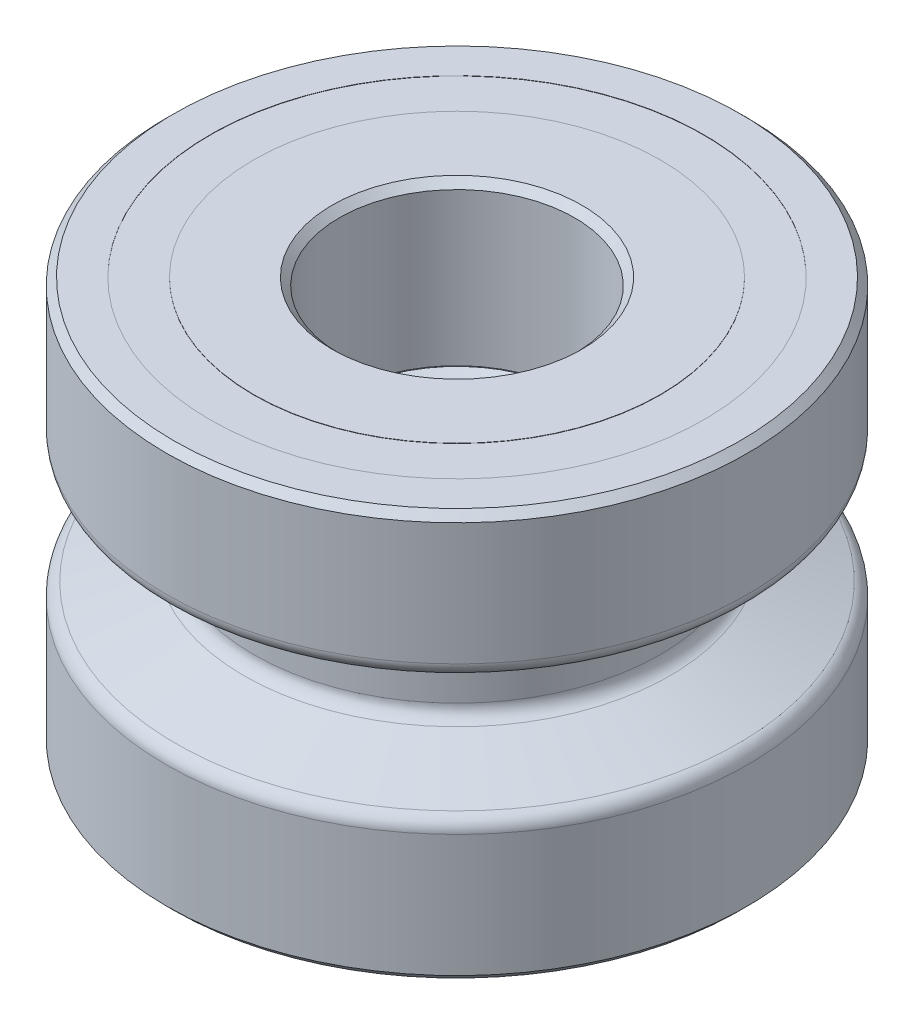
ISO-10303-21;
HEADER;
FILE_DESCRIPTION(('STEP AP214'),'2;1');
FILE_NAME('part.step','',(''),(''),'','','');
FILE_SCHEMA(('AUTOMOTIVE_DESIGN { 1 0 10303 214 1 1 1 1 }'));
ENDSEC;
DATA;
#1=APPLICATION_CONTEXT('core data for automotive mechanical design processes');
#2=APPLICATION_PROTOCOL_DEFINITION('international standard','automotive_design',2000,#1);
#3=PRODUCT_CONTEXT('',#1,'mechanical');
#4=PRODUCT('Part','Part','',(#3));
#5=PRODUCT_RELATED_PRODUCT_CATEGORY('part','',(#4));
#6=PRODUCT_DEFINITION_FORMATION('','',#4);
#7=PRODUCT_DEFINITION_CONTEXT('part definition',#1,'design');
#8=PRODUCT_DEFINITION('design','',#6,#7);
#9=PRODUCT_DEFINITION_SHAPE('','',#8);
#10=(LENGTH_UNIT() NAMED_UNIT(*) SI_UNIT(.MILLI.,.METRE.));
#11=(NAMED_UNIT(*) PLANE_ANGLE_UNIT() SI_UNIT($,.RADIAN.));
#12=(NAMED_UNIT(*) SI_UNIT($,.STERADIAN.) SOLID_ANGLE_UNIT());
#13=UNCERTAINTY_MEASURE_WITH_UNIT(LENGTH_MEASURE(1.E-05),#10,'distance_accuracy_value','');
#14=(GEOMETRIC_REPRESENTATION_CONTEXT(3) GLOBAL_UNCERTAINTY_ASSIGNED_CONTEXT((#13)) GLOBAL_UNIT_ASSIGNED_CONTEXT((#10,
#11,#12)) REPRESENTATION_CONTEXT('',''));
#15=CARTESIAN_POINT('',(0.,0.,0.));
#16=DIRECTION('',(0.,0.,1.));
#17=DIRECTION('',(1.,0.,0.));
#18=AXIS2_PLACEMENT_3D('',#15,#16,#17);
#19=CARTESIAN_POINT('',(0.,7.,0.));
#20=DIRECTION('',(0.,1.,0.));
#21=DIRECTION('',(0.,0.,1.));
#22=AXIS2_PLACEMENT_3D('',#19,#20,#21);
#23=PLANE('',#22);
#24=CARTESIAN_POINT('',(0.,7.,0.));
#25=DIRECTION('',(0.,1.,0.));
#26=DIRECTION('',(0.,0.,1.));
#27=AXIS2_PLACEMENT_3D('',#24,#25,#26);
#28=CIRCLE('',#27,4.30000000000001);
#29=CARTESIAN_POINT('',(0.,7.,4.30000000000001));
#30=VERTEX_POINT('',#29);
#31=EDGE_CURVE('E61',#30,#30,#28,.F.);
#32=ORIENTED_EDGE('',*,*,#31,.T.);
#33=EDGE_LOOP('',(#32));
#34=FACE_BOUND('',#33,.T.);
#35=CARTESIAN_POINT('',(0.,7.,0.));
#36=DIRECTION('',(0.,1.,0.));
#37=DIRECTION('',(0.,0.,1.));
#38=AXIS2_PLACEMENT_3D('',#35,#36,#37);
#39=CIRCLE('',#38,7.);
#40=CARTESIAN_POINT('',(0.,7.,7.));
#41=VERTEX_POINT('',#40);
#42=EDGE_CURVE('E124',#41,#41,#39,.T.);
#43=ORIENTED_EDGE('',*,*,#42,.T.);
#44=EDGE_LOOP('',(#43));
#45=FACE_BOUND('',#44,.T.);
#46=ADVANCED_FACE('F42',(#34,#45),#23,.T.);
#47=CARTESIAN_POINT('',(0.,7.001,0.));
#48=DIRECTION('',(0.,-1.,0.));
#49=DIRECTION('',(0.,0.,-1.));
#50=AXIS2_PLACEMENT_3D('',#47,#48,#49);
#51=CYLINDRICAL_SURFACE('',#50,3.5);
#52=CARTESIAN_POINT('',(0.,1.20000000000001,0.));
#53=DIRECTION('',(0.,1.,0.));
#54=DIRECTION('',(0.,0.,1.));
#55=AXIS2_PLACEMENT_3D('',#52,#53,#54);
#56=CIRCLE('',#55,3.5);
#57=CARTESIAN_POINT('',(0.,1.2,-3.5));
#58=VERTEX_POINT('',#57);
#59=EDGE_CURVE('E10',#58,#58,#56,.T.);
#60=CARTESIAN_POINT('',(0.,-4.5,0.));
#61=DIRECTION('',(0.,-1.,0.));
#62=DIRECTION('',(0.,0.,-1.));
#63=AXIS2_PLACEMENT_3D('',#60,#61,#62);
#64=CIRCLE('',#63,3.5);
#65=CARTESIAN_POINT('',(0.,-4.5,-3.5));
#66=VERTEX_POINT('',#65);
#67=EDGE_CURVE('E85',#66,#66,#64,.F.);
#68=CARTESIAN_POINT('',(0.,1.2,-3.5));
#69=CARTESIAN_POINT('',(0.,1.140625,-3.5));
#70=CARTESIAN_POINT('',(0.,1.08125,-3.5));
#71=CARTESIAN_POINT('',(0.,0.962500000000004,-3.5));
#72=CARTESIAN_POINT('',(0.,0.903125000000004,-3.5));
#73=CARTESIAN_POINT('',(0.,0.784375000000004,-3.5));
#74=CARTESIAN_POINT('',(0.,0.725000000000005,-3.5));
#75=CARTESIAN_POINT('',(0.,0.606250000000005,-3.5));
#76=CARTESIAN_POINT('',(0.,0.546875000000005,-3.5));
#77=CARTESIAN_POINT('',(0.,0.428125000000004,-3.5));
#78=CARTESIAN_POINT('',(0.,0.368750000000004,-3.5));
#79=CARTESIAN_POINT('',(0.,0.250000000000004,-3.5));
#80=CARTESIAN_POINT('',(0.,0.190625000000004,-3.5));
#81=CARTESIAN_POINT('',(0.,0.0718750000000037,-3.5));
#82=CARTESIAN_POINT('',(0.,0.0125000000000035,-3.5));
#83=CARTESIAN_POINT('',(0.,-0.106249999999996,-3.5));
#84=CARTESIAN_POINT('',(0.,-0.165624999999996,-3.5));
#85=CARTESIAN_POINT('',(0.,-0.284374999999996,-3.5));
#86=CARTESIAN_POINT('',(0.,-0.343749999999996,-3.5));
#87=CARTESIAN_POINT('',(0.,-0.462499999999996,-3.5));
#88=CARTESIAN_POINT('',(0.,-0.521874999999997,-3.5));
#89=CARTESIAN_POINT('',(0.,-0.640624999999997,-3.5));
#90=CARTESIAN_POINT('',(0.,-0.699999999999997,-3.5));
#91=CARTESIAN_POINT('',(0.,-0.818749999999997,-3.5));
#92=CARTESIAN_POINT('',(0.,-0.878124999999997,-3.5));
#93=CARTESIAN_POINT('',(0.,-0.996874999999996,-3.5));
#94=CARTESIAN_POINT('',(0.,-1.05625,-3.5));
#95=CARTESIAN_POINT('',(0.,-1.175,-3.5));
#96=CARTESIAN_POINT('',(0.,-1.234375,-3.5));
#97=CARTESIAN_POINT('',(0.,-1.353125,-3.5));
#98=CARTESIAN_POINT('',(0.,-1.4125,-3.5));
#99=CARTESIAN_POINT('',(0.,-1.53125,-3.5));
#100=CARTESIAN_POINT('',(0.,-1.590625,-3.5));
#101=CARTESIAN_POINT('',(0.,-1.709375,-3.5));
#102=CARTESIAN_POINT('',(0.,-1.76875,-3.5));
#103=CARTESIAN_POINT('',(0.,-1.8875,-3.5));
#104=CARTESIAN_POINT('',(0.,-1.946875,-3.5));
#105=CARTESIAN_POINT('',(0.,-2.065625,-3.5));
#106=CARTESIAN_POINT('',(0.,-2.125,-3.5));
#107=CARTESIAN_POINT('',(0.,-2.24375,-3.5));
#108=CARTESIAN_POINT('',(0.,-2.303125,-3.5));
#109=CARTESIAN_POINT('',(0.,-2.421875,-3.5));
#110=CARTESIAN_POINT('',(0.,-2.48125,-3.5));
#111=CARTESIAN_POINT('',(0.,-2.6,-3.5));
#112=CARTESIAN_POINT('',(0.,-2.659375,-3.5));
#113=CARTESIAN_POINT('',(0.,-2.778125,-3.5));
#114=CARTESIAN_POINT('',(0.,-2.8375,-3.5));
#115=CARTESIAN_POINT('',(0.,-2.95625,-3.5));
#116=CARTESIAN_POINT('',(0.,-3.015625,-3.5));
#117=CARTESIAN_POINT('',(0.,-3.134375,-3.5));
#118=CARTESIAN_POINT('',(0.,-3.19375,-3.5));
#119=CARTESIAN_POINT('',(0.,-3.3125,-3.5));
#120=CARTESIAN_POINT('',(0.,-3.371875,-3.5));
#121=CARTESIAN_POINT('',(0.,-3.490625,-3.5));
#122=CARTESIAN_POINT('',(0.,-3.55,-3.5));
#123=CARTESIAN_POINT('',(0.,-3.66875,-3.5));
#124=CARTESIAN_POINT('',(0.,-3.728125,-3.5));
#125=CARTESIAN_POINT('',(0.,-3.846875,-3.5));
#126=CARTESIAN_POINT('',(0.,-3.90625,-3.5));
#127=CARTESIAN_POINT('',(0.,-4.025,-3.5));
#128=CARTESIAN_POINT('',(0.,-4.084375,-3.5));
#129=CARTESIAN_POINT('',(0.,-4.203125,-3.5));
#130=CARTESIAN_POINT('',(0.,-4.2625,-3.5));
#131=CARTESIAN_POINT('',(0.,-4.38125,-3.5));
#132=CARTESIAN_POINT('',(0.,-4.440625,-3.5));
#133=CARTESIAN_POINT('',(0.,-4.5,-3.5));
#134=B_SPLINE_CURVE_WITH_KNOTS('',3,(#68,#69,#70,#71,#72,#73,#74,#75,#76,#77,#78,#79,#80,#81,
#82,#83,#84,#85,#86,#87,#88,#89,#90,#91,#92,#93,#94,#95,#96,#97,#98,#99,#100,#101,#102,#103,
#104,#105,#106,#107,#108,#109,#110,#111,#112,#113,#114,#115,#116,#117,#118,#119,#120,#121,#122,
#123,#124,#125,#126,#127,#128,#129,#130,#131,#132,#133),.UNSPECIFIED.,.F.,.F.,(4,2,2,2,2,2,2,2,
2,2,2,2,2,2,2,2,2,2,2,2,2,2,2,2,2,2,2,2,2,2,2,2,4),(0.,0.178125,0.356250000000001,0.534375,
0.7125,0.890625000000001,1.06875,1.246875,1.425,1.603125,1.78125,1.959375,2.1375,2.315625,
2.49375,2.671875,2.85,3.028125,3.20625,3.384375,3.5625,3.740625,3.91875,4.096875,4.275,4.453125,
4.63125,4.809375,4.9875,5.165625,5.34375,5.521875,5.7),.UNSPECIFIED.);
#135=EDGE_CURVE('BSEAM161',#58,#66,#134,.T.);
#136=ORIENTED_EDGE('',*,*,#59,.T.);
#137=ORIENTED_EDGE('',*,*,#67,.F.);
#138=ORIENTED_EDGE('',*,*,#135,.T.);
#139=ORIENTED_EDGE('',*,*,#135,.F.);
#140=EDGE_LOOP('',(#136,#138,#137,#139));
#141=FACE_BOUND('',#140,.T.);
#142=ADVANCED_FACE('F161',(#141),#51,.F.);
#143=CARTESIAN_POINT('',(0.,7.,0.));
#144=DIRECTION('',(0.,-1.,0.));
#145=DIRECTION('',(0.,0.,-1.));
#146=AXIS2_PLACEMENT_3D('',#143,#144,#145);
#147=CYLINDRICAL_SURFACE('',#146,10.);
#148=CARTESIAN_POINT('',(0.,-6.74999999999999,0.));
#149=DIRECTION('',(0.,1.,0.));
#150=DIRECTION('',(0.,0.,1.));
#151=AXIS2_PLACEMENT_3D('',#148,#149,#150);
#152=CIRCLE('',#151,10.);
#153=CARTESIAN_POINT('',(0.,-6.74999999999999,10.));
#154=VERTEX_POINT('',#153);
#155=EDGE_CURVE('E78',#154,#154,#152,.T.);
#156=ORIENTED_EDGE('',*,*,#155,.T.);
#157=EDGE_LOOP('',(#156));
#158=FACE_BOUND('',#157,.T.);
#159=CARTESIAN_POINT('',(0.,-2.54201447190344,0.));
#160=DIRECTION('',(0.,-1.,0.));
#161=DIRECTION('',(0.,0.,-1.));
#162=AXIS2_PLACEMENT_3D('',#159,#160,#161);
#163=CIRCLE('',#162,10.);
#164=CARTESIAN_POINT('',(0.,-2.54201447190344,-10.));
#165=VERTEX_POINT('',#164);
#166=EDGE_CURVE('E82',#165,#165,#163,.T.);
#167=ORIENTED_EDGE('',*,*,#166,.T.);
#168=EDGE_LOOP('',(#167));
#169=FACE_BOUND('',#168,.T.);
#170=ADVANCED_FACE('F156',(#158,#169),#147,.T.);
#171=CARTESIAN_POINT('',(0.,6.75,0.));
#172=DIRECTION('',(0.,1.,0.));
#173=DIRECTION('',(0.,0.,1.));
#174=AXIS2_PLACEMENT_3D('',#171,#172,#173);
#175=CIRCLE('',#174,10.);
#176=CARTESIAN_POINT('',(0.,6.75,10.));
#177=VERTEX_POINT('',#176);
#178=EDGE_CURVE('E57',#177,#177,#175,.F.);
#179=ORIENTED_EDGE('',*,*,#178,.T.);
#180=EDGE_LOOP('',(#179));
#181=FACE_BOUND('',#180,.T.);
#182=CARTESIAN_POINT('',(0.,2.54201447190344,0.));
#183=DIRECTION('',(0.,-1.,0.));
#184=DIRECTION('',(0.,0.,-1.));
#185=AXIS2_PLACEMENT_3D('',#182,#183,#184);
#186=CIRCLE('',#185,10.);
#187=CARTESIAN_POINT('',(0.,2.54201447190344,-10.));
#188=VERTEX_POINT('',#187);
#189=EDGE_CURVE('E93',#188,#188,#186,.F.);
#190=ORIENTED_EDGE('',*,*,#189,.T.);
#191=EDGE_LOOP('',(#190));
#192=FACE_BOUND('',#191,.T.);
#193=ADVANCED_FACE('F147',(#181,#192),#147,.T.);
#194=CARTESIAN_POINT('',(0.,7.,0.));
#195=DIRECTION('',(0.,1.,0.));
#196=DIRECTION('',(0.,0.,1.));
#197=AXIS2_PLACEMENT_3D('',#194,#195,#196);
#198=CIRCLE('',#197,9.74999999999999);
#199=CARTESIAN_POINT('',(0.,7.,9.74999999999999));
#200=VERTEX_POINT('',#199);
#201=EDGE_CURVE('E58',#200,#200,#198,.T.);
#202=ORIENTED_EDGE('',*,*,#201,.T.);
#203=EDGE_LOOP('',(#202));
#204=FACE_BOUND('',#203,.T.);
#205=CARTESIAN_POINT('',(0.,7.,0.));
#206=DIRECTION('',(0.,1.,0.));
#207=DIRECTION('',(0.,0.,1.));
#208=AXIS2_PLACEMENT_3D('',#205,#206,#207);
#209=CIRCLE('',#208,8.5);
#210=CARTESIAN_POINT('',(0.,7.,8.5));
#211=VERTEX_POINT('',#210);
#212=EDGE_CURVE('E120',#211,#211,#209,.T.);
#213=ORIENTED_EDGE('',*,*,#212,.F.);
#214=EDGE_LOOP('',(#213));
#215=FACE_BOUND('',#214,.T.);
#216=ADVANCED_FACE('F143',(#204,#215),#23,.T.);
#217=CARTESIAN_POINT('',(0.,-7.,0.));
#218=DIRECTION('',(0.,1.,0.));
#219=DIRECTION('',(0.,0.,1.));
#220=AXIS2_PLACEMENT_3D('',#217,#218,#219);
#221=PLANE('',#220);
#222=CARTESIAN_POINT('',(0.,-7.,0.));
#223=DIRECTION('',(0.,1.,0.));
#224=DIRECTION('',(0.,0.,1.));
#225=AXIS2_PLACEMENT_3D('',#222,#223,#224);
#226=CIRCLE('',#225,9.75);
#227=CARTESIAN_POINT('',(0.,-7.,9.75));
#228=VERTEX_POINT('',#227);
#229=EDGE_CURVE('E72',#228,#228,#226,.F.);
#230=ORIENTED_EDGE('',*,*,#229,.T.);
#231=EDGE_LOOP('',(#230));
#232=FACE_BOUND('',#231,.T.);
#233=CARTESIAN_POINT('',(0.,-7.,0.));
#234=DIRECTION('',(0.,1.,0.));
#235=DIRECTION('',(0.,0.,1.));
#236=AXIS2_PLACEMENT_3D('',#233,#234,#235);
#237=CIRCLE('',#236,4.30000000000001);
#238=CARTESIAN_POINT('',(0.,-7.,4.30000000000001));
#239=VERTEX_POINT('',#238);
#240=EDGE_CURVE('E80',#239,#239,#237,.T.);
#241=ORIENTED_EDGE('',*,*,#240,.T.);
#242=EDGE_LOOP('',(#241));
#243=FACE_BOUND('',#242,.T.);
#244=ADVANCED_FACE('F149',(#232,#243),#221,.F.);
#245=CARTESIAN_POINT('',(0.,-1.1,0.));
#246=DIRECTION('',(0.,-1.,0.));
#247=DIRECTION('',(0.,0.,-1.));
#248=AXIS2_PLACEMENT_3D('',#245,#246,#247);
#249=CONICAL_SURFACE('',#248,7.,1.22173047639604);
#250=CARTESIAN_POINT('',(0.,-1.2197425412881,0.));
#251=DIRECTION('',(0.,-1.,0.));
#252=DIRECTION('',(0.,0.,-1.));
#253=AXIS2_PLACEMENT_3D('',#250,#251,#252);
#254=CIRCLE('',#253,7.32898992833717);
#255=CARTESIAN_POINT('',(0.,-1.2197425412881,-7.32898992833717));
#256=VERTEX_POINT('',#255);
#257=EDGE_CURVE('E99',#256,#256,#254,.T.);
#258=ORIENTED_EDGE('',*,*,#257,.T.);
#259=EDGE_LOOP('',(#258));
#260=FACE_BOUND('',#259,.T.);
#261=CARTESIAN_POINT('',(0.,-2.07216816151049,0.));
#262=DIRECTION('',(0.,-1.,0.));
#263=DIRECTION('',(0.,0.,-1.));
#264=AXIS2_PLACEMENT_3D('',#261,#262,#263);
#265=CIRCLE('',#264,9.67101007166283);
#266=CARTESIAN_POINT('',(0.,-2.07216816151049,-9.67101007166283));
#267=VERTEX_POINT('',#266);
#268=EDGE_CURVE('E101',#267,#267,#265,.F.);
#269=ORIENTED_EDGE('',*,*,#268,.T.);
#270=EDGE_LOOP('',(#269));
#271=FACE_BOUND('',#270,.T.);
#272=ADVANCED_FACE('F155',(#260,#271),#249,.T.);
#273=CARTESIAN_POINT('',(0.,7.,0.));
#274=DIRECTION('',(0.,1.,0.));
#275=DIRECTION('',(0.,0.,1.));
#276=AXIS2_PLACEMENT_3D('',#273,#274,#275);
#277=CYLINDRICAL_SURFACE('',#276,7.);
#278=CARTESIAN_POINT('',(0.,-0.749896230895142,0.));
#279=DIRECTION('',(0.,1.,0.));
#280=DIRECTION('',(0.,0.,1.));
#281=AXIS2_PLACEMENT_3D('',#278,#279,#280);
#282=CIRCLE('',#281,7.);
#283=CARTESIAN_POINT('',(0.,-0.749896230895142,7.));
#284=VERTEX_POINT('',#283);
#285=EDGE_CURVE('E106',#284,#284,#282,.T.);
#286=ORIENTED_EDGE('',*,*,#285,.T.);
#287=EDGE_LOOP('',(#286));
#288=FACE_BOUND('',#287,.T.);
#289=CARTESIAN_POINT('',(0.,0.749896230895143,0.));
#290=DIRECTION('',(0.,1.,0.));
#291=DIRECTION('',(0.,0.,1.));
#292=AXIS2_PLACEMENT_3D('',#289,#290,#291);
#293=CIRCLE('',#292,7.);
#294=CARTESIAN_POINT('',(0.,0.749896230895143,7.));
#295=VERTEX_POINT('',#294);
#296=EDGE_CURVE('E87',#295,#295,#293,.F.);
#297=ORIENTED_EDGE('',*,*,#296,.T.);
#298=EDGE_LOOP('',(#297));
#299=FACE_BOUND('',#298,.T.);
#300=ADVANCED_FACE('F205',(#288,#299),#277,.T.);
#301=CARTESIAN_POINT('',(0.,2.19191070279859,0.));
#302=DIRECTION('',(0.,1.,0.));
#303=DIRECTION('',(0.,0.,1.));
#304=AXIS2_PLACEMENT_3D('',#301,#302,#303);
#305=CONICAL_SURFACE('',#304,10.,1.22173047639604);
#306=CARTESIAN_POINT('',(0.,1.2197425412881,0.));
#307=DIRECTION('',(0.,1.,0.));
#308=DIRECTION('',(0.,0.,1.));
#309=AXIS2_PLACEMENT_3D('',#306,#307,#308);
#310=CIRCLE('',#309,7.32898992833717);
#311=CARTESIAN_POINT('',(0.,1.2197425412881,7.32898992833717));
#312=VERTEX_POINT('',#311);
#313=EDGE_CURVE('E92',#312,#312,#310,.T.);
#314=ORIENTED_EDGE('',*,*,#313,.T.);
#315=EDGE_LOOP('',(#314));
#316=FACE_BOUND('',#315,.T.);
#317=CARTESIAN_POINT('',(0.,2.07216816151048,0.));
#318=DIRECTION('',(0.,1.,0.));
#319=DIRECTION('',(0.,0.,1.));
#320=AXIS2_PLACEMENT_3D('',#317,#318,#319);
#321=CIRCLE('',#320,9.67101007166283);
#322=CARTESIAN_POINT('',(0.,2.07216816151048,9.67101007166283));
#323=VERTEX_POINT('',#322);
#324=EDGE_CURVE('E97',#323,#323,#321,.F.);
#325=ORIENTED_EDGE('',*,*,#324,.T.);
#326=EDGE_LOOP('',(#325));
#327=FACE_BOUND('',#326,.T.);
#328=ADVANCED_FACE('F196',(#316,#327),#305,.T.);
#329=CARTESIAN_POINT('',(0.,-0.749896230895142,0.));
#330=DIRECTION('',(0.,1.,0.));
#331=DIRECTION('',(0.,0.,1.));
#332=AXIS2_PLACEMENT_3D('',#329,#330,#331);
#333=TOROIDAL_SURFACE('',#332,7.5,0.5);
#334=ORIENTED_EDGE('',*,*,#257,.F.);
#335=EDGE_LOOP('',(#334));
#336=FACE_BOUND('',#335,.T.);
#337=ORIENTED_EDGE('',*,*,#285,.F.);
#338=EDGE_LOOP('',(#337));
#339=FACE_BOUND('',#338,.T.);
#340=ADVANCED_FACE('F201',(#336,#339),#333,.F.);
#341=CARTESIAN_POINT('',(0.,0.749896230895143,0.));
#342=DIRECTION('',(0.,1.,0.));
#343=DIRECTION('',(0.,0.,1.));
#344=AXIS2_PLACEMENT_3D('',#341,#342,#343);
#345=TOROIDAL_SURFACE('',#344,7.5,0.5);
#346=ORIENTED_EDGE('',*,*,#296,.F.);
#347=EDGE_LOOP('',(#346));
#348=FACE_BOUND('',#347,.T.);
#349=ORIENTED_EDGE('',*,*,#313,.F.);
#350=EDGE_LOOP('',(#349));
#351=FACE_BOUND('',#350,.T.);
#352=ADVANCED_FACE('F225',(#348,#351),#345,.F.);
#353=CARTESIAN_POINT('',(0.,2.54201447190344,0.));
#354=DIRECTION('',(0.,-1.,0.));
#355=DIRECTION('',(0.,0.,-1.));
#356=AXIS2_PLACEMENT_3D('',#353,#354,#355);
#357=TOROIDAL_SURFACE('',#356,9.5,0.5);
#358=ORIENTED_EDGE('',*,*,#324,.F.);
#359=EDGE_LOOP('',(#358));
#360=FACE_BOUND('',#359,.T.);
#361=ORIENTED_EDGE('',*,*,#189,.F.);
#362=EDGE_LOOP('',(#361));
#363=FACE_BOUND('',#362,.T.);
#364=ADVANCED_FACE('F216',(#360,#363),#357,.T.);
#365=CARTESIAN_POINT('',(0.,-2.54201447190344,0.));
#366=DIRECTION('',(0.,-1.,0.));
#367=DIRECTION('',(0.,0.,-1.));
#368=AXIS2_PLACEMENT_3D('',#365,#366,#367);
#369=TOROIDAL_SURFACE('',#368,9.5,0.5);
#370=ORIENTED_EDGE('',*,*,#166,.F.);
#371=EDGE_LOOP('',(#370));
#372=FACE_BOUND('',#371,.T.);
#373=ORIENTED_EDGE('',*,*,#268,.F.);
#374=EDGE_LOOP('',(#373));
#375=FACE_BOUND('',#374,.T.);
#376=ADVANCED_FACE('F192',(#372,#375),#369,.T.);
#377=CARTESIAN_POINT('',(0.,-4.5,0.));
#378=DIRECTION('',(0.,-1.,0.));
#379=DIRECTION('',(0.,0.,-1.));
#380=AXIS2_PLACEMENT_3D('',#377,#378,#379);
#381=PLANE('',#380);
#382=CARTESIAN_POINT('',(0.,-4.5,0.));
#383=DIRECTION('',(0.,-1.,0.));
#384=DIRECTION('',(0.,0.,-1.));
#385=AXIS2_PLACEMENT_3D('',#382,#383,#384);
#386=CIRCLE('',#385,4.05);
#387=CARTESIAN_POINT('',(0.,-4.5,-4.05));
#388=VERTEX_POINT('',#387);
#389=EDGE_CURVE('E89',#388,#388,#386,.T.);
#390=ORIENTED_EDGE('',*,*,#389,.T.);
#391=EDGE_LOOP('',(#390));
#392=FACE_BOUND('',#391,.T.);
#393=ORIENTED_EDGE('',*,*,#67,.T.);
#394=EDGE_LOOP('',(#393));
#395=FACE_BOUND('',#394,.T.);
#396=ADVANCED_FACE('F188',(#392,#395),#381,.T.);
#397=CARTESIAN_POINT('',(0.,-4.5,0.));
#398=DIRECTION('',(0.,-1.,0.));
#399=DIRECTION('',(0.,0.,-1.));
#400=AXIS2_PLACEMENT_3D('',#397,#398,#399);
#401=CYLINDRICAL_SURFACE('',#400,4.05);
#402=CARTESIAN_POINT('',(0.,-6.74999999999999,0.));
#403=DIRECTION('',(0.,1.,0.));
#404=DIRECTION('',(0.,0.,1.));
#405=AXIS2_PLACEMENT_3D('',#402,#403,#404);
#406=CIRCLE('',#405,4.05);
#407=CARTESIAN_POINT('',(0.,-6.74999999999999,4.05));
#408=VERTEX_POINT('',#407);
#409=EDGE_CURVE('E71',#408,#408,#406,.F.);
#410=ORIENTED_EDGE('',*,*,#409,.T.);
#411=EDGE_LOOP('',(#410));
#412=FACE_BOUND('',#411,.T.);
#413=ORIENTED_EDGE('',*,*,#389,.F.);
#414=EDGE_LOOP('',(#413));
#415=FACE_BOUND('',#414,.T.);
#416=ADVANCED_FACE('F187',(#412,#415),#401,.F.);
#417=CARTESIAN_POINT('',(0.,1.5,0.));
#418=DIRECTION('',(0.,1.,0.));
#419=DIRECTION('',(0.,0.,1.));
#420=AXIS2_PLACEMENT_3D('',#417,#418,#419);
#421=PLANE('',#420);
#422=CARTESIAN_POINT('',(0.,1.5,0.));
#423=DIRECTION('',(0.,1.,0.));
#424=DIRECTION('',(0.,0.,1.));
#425=AXIS2_PLACEMENT_3D('',#422,#423,#424);
#426=CIRCLE('',#425,4.01961524227066);
#427=CARTESIAN_POINT('',(0.,1.5,4.01961524227066));
#428=VERTEX_POINT('',#427);
#429=EDGE_CURVE('E55',#428,#428,#426,.F.);
#430=ORIENTED_EDGE('',*,*,#429,.T.);
#431=EDGE_LOOP('',(#430));
#432=FACE_BOUND('',#431,.T.);
#433=CARTESIAN_POINT('',(0.,1.5,0.));
#434=DIRECTION('',(0.,1.,0.));
#435=DIRECTION('',(0.,0.,1.));
#436=AXIS2_PLACEMENT_3D('',#433,#434,#435);
#437=CIRCLE('',#436,4.05);
#438=CARTESIAN_POINT('',(0.,1.5,4.05));
#439=VERTEX_POINT('',#438);
#440=EDGE_CURVE('E113',#439,#439,#437,.T.);
#441=ORIENTED_EDGE('',*,*,#440,.T.);
#442=EDGE_LOOP('',(#441));
#443=FACE_BOUND('',#442,.T.);
#444=ADVANCED_FACE('F182',(#432,#443),#421,.T.);
#445=CARTESIAN_POINT('',(0.,1.5,0.));
#446=DIRECTION('',(0.,1.,0.));
#447=DIRECTION('',(0.,0.,1.));
#448=AXIS2_PLACEMENT_3D('',#445,#446,#447);
#449=CYLINDRICAL_SURFACE('',#448,4.05);
#450=CARTESIAN_POINT('',(0.,6.74999999999999,0.));
#451=DIRECTION('',(0.,1.,0.));
#452=DIRECTION('',(0.,0.,1.));
#453=AXIS2_PLACEMENT_3D('',#450,#451,#452);
#454=CIRCLE('',#453,4.05);
#455=CARTESIAN_POINT('',(0.,6.74999999999999,4.05));
#456=VERTEX_POINT('',#455);
#457=EDGE_CURVE('E66',#456,#456,#454,.T.);
#458=ORIENTED_EDGE('',*,*,#457,.T.);
#459=EDGE_LOOP('',(#458));
#460=FACE_BOUND('',#459,.T.);
#461=ORIENTED_EDGE('',*,*,#440,.F.);
#462=EDGE_LOOP('',(#461));
#463=FACE_BOUND('',#462,.T.);
#464=ADVANCED_FACE('F142',(#460,#463),#449,.F.);
#465=CARTESIAN_POINT('',(0.,6.99,0.));
#466=DIRECTION('',(0.,1.,0.));
#467=DIRECTION('',(0.,0.,1.));
#468=AXIS2_PLACEMENT_3D('',#465,#466,#467);
#469=CYLINDRICAL_SURFACE('',#468,8.5);
#470=CARTESIAN_POINT('',(0.,6.99,0.));
#471=DIRECTION('',(0.,1.,0.));
#472=DIRECTION('',(0.,0.,1.));
#473=AXIS2_PLACEMENT_3D('',#470,#471,#472);
#474=CIRCLE('',#473,8.5);
#475=CARTESIAN_POINT('',(0.,6.99,8.5));
#476=VERTEX_POINT('',#475);
#477=EDGE_CURVE('E116',#476,#476,#474,.T.);
#478=CARTESIAN_POINT('',(0.,6.99,8.5));
#479=CARTESIAN_POINT('',(0.,6.99010416666667,8.5));
#480=CARTESIAN_POINT('',(0.,6.99020833333333,8.5));
#481=CARTESIAN_POINT('',(0.,6.99041666666667,8.5));
#482=CARTESIAN_POINT('',(0.,6.99052083333333,8.5));
#483=CARTESIAN_POINT('',(0.,6.99072916666667,8.5));
#484=CARTESIAN_POINT('',(0.,6.99083333333333,8.5));
#485=CARTESIAN_POINT('',(0.,6.99104166666667,8.5));
#486=CARTESIAN_POINT('',(0.,6.99114583333333,8.5));
#487=CARTESIAN_POINT('',(0.,6.99135416666667,8.5));
#488=CARTESIAN_POINT('',(0.,6.99145833333333,8.5));
#489=CARTESIAN_POINT('',(0.,6.99166666666667,8.5));
#490=CARTESIAN_POINT('',(0.,6.99177083333333,8.5));
#491=CARTESIAN_POINT('',(0.,6.99197916666667,8.5));
#492=CARTESIAN_POINT('',(0.,6.99208333333333,8.5));
#493=CARTESIAN_POINT('',(0.,6.99229166666667,8.5));
#494=CARTESIAN_POINT('',(0.,6.99239583333333,8.5));
#495=CARTESIAN_POINT('',(0.,6.99260416666667,8.5));
#496=CARTESIAN_POINT('',(0.,6.99270833333333,8.5));
#497=CARTESIAN_POINT('',(0.,6.99291666666667,8.5));
#498=CARTESIAN_POINT('',(0.,6.99302083333333,8.5));
#499=CARTESIAN_POINT('',(0.,6.99322916666667,8.5));
#500=CARTESIAN_POINT('',(0.,6.99333333333333,8.5));
#501=CARTESIAN_POINT('',(0.,6.99354166666667,8.5));
#502=CARTESIAN_POINT('',(0.,6.99364583333333,8.5));
#503=CARTESIAN_POINT('',(0.,6.99385416666667,8.5));
#504=CARTESIAN_POINT('',(0.,6.99395833333333,8.5));
#505=CARTESIAN_POINT('',(0.,6.99416666666667,8.5));
#506=CARTESIAN_POINT('',(0.,6.99427083333333,8.5));
#507=CARTESIAN_POINT('',(0.,6.99447916666667,8.5));
#508=CARTESIAN_POINT('',(0.,6.99458333333333,8.5));
#509=CARTESIAN_POINT('',(0.,6.99479166666667,8.5));
#510=CARTESIAN_POINT('',(0.,6.99489583333333,8.5));
#511=CARTESIAN_POINT('',(0.,6.99510416666667,8.5));
#512=CARTESIAN_POINT('',(0.,6.99520833333333,8.5));
#513=CARTESIAN_POINT('',(0.,6.99541666666667,8.5));
#514=CARTESIAN_POINT('',(0.,6.99552083333333,8.5));
#515=CARTESIAN_POINT('',(0.,6.99572916666667,8.5));
#516=CARTESIAN_POINT('',(0.,6.99583333333333,8.5));
#517=CARTESIAN_POINT('',(0.,6.99604166666667,8.5));
#518=CARTESIAN_POINT('',(0.,6.99614583333333,8.5));
#519=CARTESIAN_POINT('',(0.,6.99635416666667,8.5));
#520=CARTESIAN_POINT('',(0.,6.99645833333333,8.5));
#521=CARTESIAN_POINT('',(0.,6.99666666666667,8.5));
#522=CARTESIAN_POINT('',(0.,6.99677083333333,8.5));
#523=CARTESIAN_POINT('',(0.,6.99697916666667,8.5));
#524=CARTESIAN_POINT('',(0.,6.99708333333333,8.5));
#525=CARTESIAN_POINT('',(0.,6.99729166666667,8.5));
#526=CARTESIAN_POINT('',(0.,6.99739583333333,8.5));
#527=CARTESIAN_POINT('',(0.,6.99760416666667,8.5));
#528=CARTESIAN_POINT('',(0.,6.99770833333333,8.5));
#529=CARTESIAN_POINT('',(0.,6.99791666666667,8.5));
#530=CARTESIAN_POINT('',(0.,6.99802083333333,8.5));
#531=CARTESIAN_POINT('',(0.,6.99822916666667,8.5));
#532=CARTESIAN_POINT('',(0.,6.99833333333333,8.5));
#533=CARTESIAN_POINT('',(0.,6.99854166666667,8.5));
#534=CARTESIAN_POINT('',(0.,6.99864583333333,8.5));
#535=CARTESIAN_POINT('',(0.,6.99885416666667,8.5));
#536=CARTESIAN_POINT('',(0.,6.99895833333333,8.5));
#537=CARTESIAN_POINT('',(0.,6.99916666666667,8.5));
#538=CARTESIAN_POINT('',(0.,6.99927083333333,8.5));
#539=CARTESIAN_POINT('',(0.,6.99947916666667,8.5));
#540=CARTESIAN_POINT('',(0.,6.99958333333333,8.5));
#541=CARTESIAN_POINT('',(0.,6.99979166666667,8.5));
#542=CARTESIAN_POINT('',(0.,6.99989583333333,8.5));
#543=CARTESIAN_POINT('',(0.,7.,8.5));
#544=B_SPLINE_CURVE_WITH_KNOTS('',3,(#478,#479,#480,#481,#482,#483,#484,#485,#486,#487,#488,
#489,#490,#491,#492,#493,#494,#495,#496,#497,#498,#499,#500,#501,#502,#503,#504,#505,#506,#507,
#508,#509,#510,#511,#512,#513,#514,#515,#516,#517,#518,#519,#520,#521,#522,#523,#524,#525,#526,
#527,#528,#529,#530,#531,#532,#533,#534,#535,#536,#537,#538,#539,#540,#541,#542,#543),
.UNSPECIFIED.,.F.,.F.,(4,2,2,2,2,2,2,2,2,2,2,2,2,2,2,2,2,2,2,2,2,2,2,2,2,2,2,2,2,2,2,2,4),(0.,
0.000312499999999445,0.000624999999999758,0.000937499999999203,0.00124999999999952,
0.00156249999999983,0.00187499999999927,0.00218749999999959,0.0024999999999999,
0.00281249999999934,0.00312499999999966,0.0034374999999991,0.00374999999999941,
0.00406249999999973,0.00437499999999917,0.00468749999999948,0.0049999999999998,
0.00531249999999924,0.00562499999999955,0.005937499999999,0.00624999999999931,
0.00656249999999962,0.00687499999999907,0.00718749999999938,0.00749999999999969,
0.00781249999999914,0.00812499999999945,0.0084374999999989,0.00874999999999921,
0.00906249999999952,0.00937499999999897,0.00968749999999928,0.00999999999999959),.UNSPECIFIED.);
#545=EDGE_CURVE('BSEAM132',#476,#211,#544,.T.);
#546=ORIENTED_EDGE('',*,*,#477,.F.);
#547=ORIENTED_EDGE('',*,*,#212,.T.);
#548=ORIENTED_EDGE('',*,*,#545,.T.);
#549=ORIENTED_EDGE('',*,*,#545,.F.);
#550=EDGE_LOOP('',(#546,#548,#547,#549));
#551=FACE_BOUND('',#550,.T.);
#552=ADVANCED_FACE('F132',(#551),#469,.F.);
#553=CARTESIAN_POINT('',(0.,6.99,0.));
#554=DIRECTION('',(0.,1.,0.));
#555=DIRECTION('',(0.,0.,1.));
#556=AXIS2_PLACEMENT_3D('',#553,#554,#555);
#557=PLANE('',#556);
#558=CARTESIAN_POINT('',(0.,6.99,0.));
#559=DIRECTION('',(0.,1.,0.));
#560=DIRECTION('',(0.,0.,1.));
#561=AXIS2_PLACEMENT_3D('',#558,#559,#560);
#562=CIRCLE('',#561,7.);
#563=CARTESIAN_POINT('',(0.,6.99,7.));
#564=VERTEX_POINT('',#563);
#565=EDGE_CURVE('E119',#564,#564,#562,.T.);
#566=ORIENTED_EDGE('',*,*,#565,.F.);
#567=EDGE_LOOP('',(#566));
#568=FACE_BOUND('',#567,.T.);
#569=ORIENTED_EDGE('',*,*,#477,.T.);
#570=EDGE_LOOP('',(#569));
#571=FACE_BOUND('',#570,.T.);
#572=ADVANCED_FACE('F135',(#568,#571),#557,.T.);
#573=CARTESIAN_POINT('',(0.,6.99,0.));
#574=DIRECTION('',(0.,1.,0.));
#575=DIRECTION('',(0.,0.,1.));
#576=AXIS2_PLACEMENT_3D('',#573,#574,#575);
#577=CYLINDRICAL_SURFACE('',#576,7.);
#578=CARTESIAN_POINT('',(0.,6.99,7.));
#579=CARTESIAN_POINT('',(0.,6.99010416666667,7.));
#580=CARTESIAN_POINT('',(0.,6.99020833333333,7.));
#581=CARTESIAN_POINT('',(0.,6.99041666666667,7.));
#582=CARTESIAN_POINT('',(0.,6.99052083333333,7.));
#583=CARTESIAN_POINT('',(0.,6.99072916666667,7.));
#584=CARTESIAN_POINT('',(0.,6.99083333333333,7.));
#585=CARTESIAN_POINT('',(0.,6.99104166666667,7.));
#586=CARTESIAN_POINT('',(0.,6.99114583333333,7.));
#587=CARTESIAN_POINT('',(0.,6.99135416666667,7.));
#588=CARTESIAN_POINT('',(0.,6.99145833333333,7.));
#589=CARTESIAN_POINT('',(0.,6.99166666666667,7.));
#590=CARTESIAN_POINT('',(0.,6.99177083333333,7.));
#591=CARTESIAN_POINT('',(0.,6.99197916666667,7.));
#592=CARTESIAN_POINT('',(0.,6.99208333333333,7.));
#593=CARTESIAN_POINT('',(0.,6.99229166666667,7.));
#594=CARTESIAN_POINT('',(0.,6.99239583333333,7.));
#595=CARTESIAN_POINT('',(0.,6.99260416666667,7.));
#596=CARTESIAN_POINT('',(0.,6.99270833333333,7.));
#597=CARTESIAN_POINT('',(0.,6.99291666666667,7.));
#598=CARTESIAN_POINT('',(0.,6.99302083333333,7.));
#599=CARTESIAN_POINT('',(0.,6.99322916666667,7.));
#600=CARTESIAN_POINT('',(0.,6.99333333333333,7.));
#601=CARTESIAN_POINT('',(0.,6.99354166666667,7.));
#602=CARTESIAN_POINT('',(0.,6.99364583333333,7.));
#603=CARTESIAN_POINT('',(0.,6.99385416666667,7.));
#604=CARTESIAN_POINT('',(0.,6.99395833333333,7.));
#605=CARTESIAN_POINT('',(0.,6.99416666666667,7.));
#606=CARTESIAN_POINT('',(0.,6.99427083333333,7.));
#607=CARTESIAN_POINT('',(0.,6.99447916666667,7.));
#608=CARTESIAN_POINT('',(0.,6.99458333333333,7.));
#609=CARTESIAN_POINT('',(0.,6.99479166666667,7.));
#610=CARTESIAN_POINT('',(0.,6.99489583333333,7.));
#611=CARTESIAN_POINT('',(0.,6.99510416666667,7.));
#612=CARTESIAN_POINT('',(0.,6.99520833333333,7.));
#613=CARTESIAN_POINT('',(0.,6.99541666666667,7.));
#614=CARTESIAN_POINT('',(0.,6.99552083333333,7.));
#615=CARTESIAN_POINT('',(0.,6.99572916666667,7.));
#616=CARTESIAN_POINT('',(0.,6.99583333333333,7.));
#617=CARTESIAN_POINT('',(0.,6.99604166666667,7.));
#618=CARTESIAN_POINT('',(0.,6.99614583333333,7.));
#619=CARTESIAN_POINT('',(0.,6.99635416666667,7.));
#620=CARTESIAN_POINT('',(0.,6.99645833333333,7.));
#621=CARTESIAN_POINT('',(0.,6.99666666666667,7.));
#622=CARTESIAN_POINT('',(0.,6.99677083333333,7.));
#623=CARTESIAN_POINT('',(0.,6.99697916666667,7.));
#624=CARTESIAN_POINT('',(0.,6.99708333333333,7.));
#625=CARTESIAN_POINT('',(0.,6.99729166666667,7.));
#626=CARTESIAN_POINT('',(0.,6.99739583333333,7.));
#627=CARTESIAN_POINT('',(0.,6.99760416666667,7.));
#628=CARTESIAN_POINT('',(0.,6.99770833333333,7.));
#629=CARTESIAN_POINT('',(0.,6.99791666666667,7.));
#630=CARTESIAN_POINT('',(0.,6.99802083333333,7.));
#631=CARTESIAN_POINT('',(0.,6.99822916666667,7.));
#632=CARTESIAN_POINT('',(0.,6.99833333333333,7.));
#633=CARTESIAN_POINT('',(0.,6.99854166666667,7.));
#634=CARTESIAN_POINT('',(0.,6.99864583333333,7.));
#635=CARTESIAN_POINT('',(0.,6.99885416666667,7.));
#636=CARTESIAN_POINT('',(0.,6.99895833333333,7.));
#637=CARTESIAN_POINT('',(0.,6.99916666666667,7.));
#638=CARTESIAN_POINT('',(0.,6.99927083333333,7.));
#639=CARTESIAN_POINT('',(0.,6.99947916666667,7.));
#640=CARTESIAN_POINT('',(0.,6.99958333333333,7.));
#641=CARTESIAN_POINT('',(0.,6.99979166666667,7.));
#642=CARTESIAN_POINT('',(0.,6.99989583333333,7.));
#643=CARTESIAN_POINT('',(0.,7.,7.));
#644=B_SPLINE_CURVE_WITH_KNOTS('',3,(#578,#579,#580,#581,#582,#583,#584,#585,#586,#587,#588,
#589,#590,#591,#592,#593,#594,#595,#596,#597,#598,#599,#600,#601,#602,#603,#604,#605,#606,#607,
#608,#609,#610,#611,#612,#613,#614,#615,#616,#617,#618,#619,#620,#621,#622,#623,#624,#625,#626,
#627,#628,#629,#630,#631,#632,#633,#634,#635,#636,#637,#638,#639,#640,#641,#642,#643),
.UNSPECIFIED.,.F.,.F.,(4,2,2,2,2,2,2,2,2,2,2,2,2,2,2,2,2,2,2,2,2,2,2,2,2,2,2,2,2,2,2,2,4),(0.,
0.000312499999999445,0.000624999999999758,0.000937499999999203,0.00124999999999952,
0.00156249999999983,0.00187499999999927,0.00218749999999959,0.0024999999999999,
0.00281249999999934,0.00312499999999966,0.0034374999999991,0.00374999999999941,
0.00406249999999973,0.00437499999999917,0.00468749999999948,0.0049999999999998,
0.00531249999999924,0.00562499999999955,0.005937499999999,0.00624999999999931,
0.00656249999999962,0.00687499999999907,0.00718749999999938,0.00749999999999969,
0.00781249999999914,0.00812499999999945,0.0084374999999989,0.00874999999999921,
0.00906249999999952,0.00937499999999897,0.00968749999999928,0.00999999999999959),.UNSPECIFIED.);
#645=EDGE_CURVE('BSEAM130',#564,#41,#644,.T.);
#646=ORIENTED_EDGE('',*,*,#565,.T.);
#647=ORIENTED_EDGE('',*,*,#42,.F.);
#648=ORIENTED_EDGE('',*,*,#645,.T.);
#649=ORIENTED_EDGE('',*,*,#645,.F.);
#650=EDGE_LOOP('',(#646,#648,#647,#649));
#651=FACE_BOUND('',#650,.T.);
#652=ADVANCED_FACE('F130',(#651),#577,.T.);
#653=CARTESIAN_POINT('',(0.,-6.74999999999999,0.));
#654=DIRECTION('',(0.,1.,0.));
#655=DIRECTION('',(0.,0.,1.));
#656=AXIS2_PLACEMENT_3D('',#653,#654,#655);
#657=CONICAL_SURFACE('',#656,10.,0.785398163397441);
#658=ORIENTED_EDGE('',*,*,#229,.F.);
#659=EDGE_LOOP('',(#658));
#660=FACE_BOUND('',#659,.T.);
#661=ORIENTED_EDGE('',*,*,#155,.F.);
#662=EDGE_LOOP('',(#661));
#663=FACE_BOUND('',#662,.T.);
#664=ADVANCED_FACE('F173',(#660,#663),#657,.T.);
#665=CARTESIAN_POINT('',(0.,-6.74999999999999,0.));
#666=DIRECTION('',(0.,-1.,0.));
#667=DIRECTION('',(0.,0.,-1.));
#668=AXIS2_PLACEMENT_3D('',#665,#666,#667);
#669=CONICAL_SURFACE('',#668,4.05,0.785398163397448);
#670=ORIENTED_EDGE('',*,*,#240,.F.);
#671=EDGE_LOOP('',(#670));
#672=FACE_BOUND('',#671,.T.);
#673=ORIENTED_EDGE('',*,*,#409,.F.);
#674=EDGE_LOOP('',(#673));
#675=FACE_BOUND('',#674,.T.);
#676=ADVANCED_FACE('F177',(#672,#675),#669,.F.);
#677=CARTESIAN_POINT('',(0.,6.74999999999999,0.));
#678=DIRECTION('',(0.,1.,0.));
#679=DIRECTION('',(0.,0.,1.));
#680=AXIS2_PLACEMENT_3D('',#677,#678,#679);
#681=CONICAL_SURFACE('',#680,4.05,0.785398163397441);
#682=ORIENTED_EDGE('',*,*,#31,.F.);
#683=EDGE_LOOP('',(#682));
#684=FACE_BOUND('',#683,.T.);
#685=ORIENTED_EDGE('',*,*,#457,.F.);
#686=EDGE_LOOP('',(#685));
#687=FACE_BOUND('',#686,.T.);
#688=ADVANCED_FACE('F240',(#684,#687),#681,.F.);
#689=CARTESIAN_POINT('',(0.,7.,0.));
#690=DIRECTION('',(0.,-1.,0.));
#691=DIRECTION('',(0.,0.,-1.));
#692=AXIS2_PLACEMENT_3D('',#689,#690,#691);
#693=CONICAL_SURFACE('',#692,9.74999999999999,0.785398163397455);
#694=ORIENTED_EDGE('',*,*,#178,.F.);
#695=EDGE_LOOP('',(#694));
#696=FACE_BOUND('',#695,.T.);
#697=ORIENTED_EDGE('',*,*,#201,.F.);
#698=EDGE_LOOP('',(#697));
#699=FACE_BOUND('',#698,.T.);
#700=ADVANCED_FACE('F243',(#696,#699),#693,.T.);
#701=CARTESIAN_POINT('',(0.,1.5,0.));
#702=DIRECTION('',(0.,1.,0.));
#703=DIRECTION('',(0.,0.,1.));
#704=AXIS2_PLACEMENT_3D('',#701,#702,#703);
#705=CONICAL_SURFACE('',#704,4.01961524227066,1.0471975511966);
#706=ORIENTED_EDGE('',*,*,#59,.F.);
#707=EDGE_LOOP('',(#706));
#708=FACE_BOUND('',#707,.T.);
#709=ORIENTED_EDGE('',*,*,#429,.F.);
#710=EDGE_LOOP('',(#709));
#711=FACE_BOUND('',#710,.T.);
#712=ADVANCED_FACE('F50',(#708,#711),#705,.F.);
#713=CLOSED_SHELL('',(#46,#142,#170,#193,#216,#244,#272,#300,#328,#340,#352,#364,#376,#396,#416,
#444,#464,#552,#572,#652,#664,#676,#688,#700,#712));
#714=MANIFOLD_SOLID_BREP('B2',#713);
#715=ADVANCED_BREP_SHAPE_REPRESENTATION('',(#18,#714),#14);
#716=SHAPE_DEFINITION_REPRESENTATION(#9,#715);
ENDSEC;
END-ISO-10303-21;
